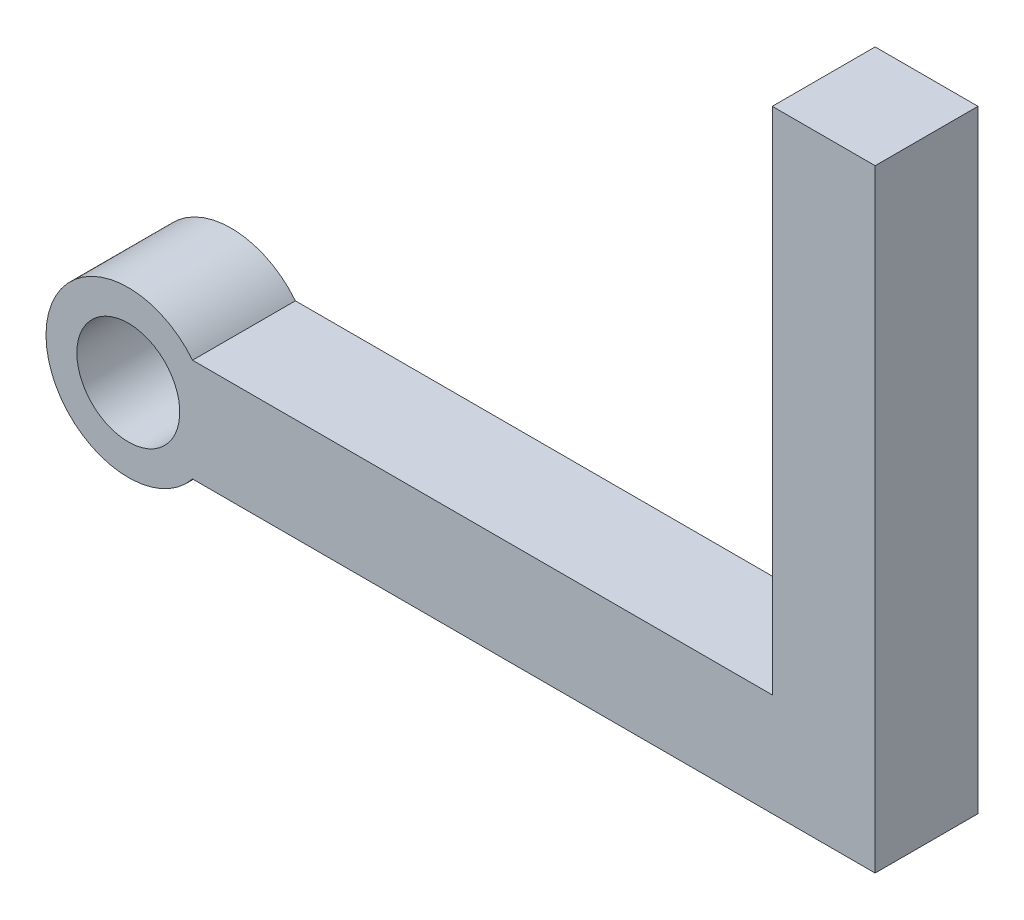
ISO-10303-21;
HEADER;
FILE_DESCRIPTION(('STEP AP214'),'2;1');
FILE_NAME('part.step','',(''),(''),'','','');
FILE_SCHEMA(('AUTOMOTIVE_DESIGN { 1 0 10303 214 1 1 1 1 }'));
ENDSEC;
DATA;
#1=APPLICATION_CONTEXT('core data for automotive mechanical design processes');
#2=APPLICATION_PROTOCOL_DEFINITION('international standard','automotive_design',2000,#1);
#3=PRODUCT_CONTEXT('',#1,'mechanical');
#4=PRODUCT('Part','Part','',(#3));
#5=PRODUCT_RELATED_PRODUCT_CATEGORY('part','',(#4));
#6=PRODUCT_DEFINITION_FORMATION('','',#4);
#7=PRODUCT_DEFINITION_CONTEXT('part definition',#1,'design');
#8=PRODUCT_DEFINITION('design','',#6,#7);
#9=PRODUCT_DEFINITION_SHAPE('','',#8);
#10=(LENGTH_UNIT() NAMED_UNIT(*) SI_UNIT(.MILLI.,.METRE.));
#11=(NAMED_UNIT(*) PLANE_ANGLE_UNIT() SI_UNIT($,.RADIAN.));
#12=(NAMED_UNIT(*) SI_UNIT($,.STERADIAN.) SOLID_ANGLE_UNIT());
#13=UNCERTAINTY_MEASURE_WITH_UNIT(LENGTH_MEASURE(1.E-05),#10,'distance_accuracy_value','');
#14=(GEOMETRIC_REPRESENTATION_CONTEXT(3) GLOBAL_UNCERTAINTY_ASSIGNED_CONTEXT((#13)) GLOBAL_UNIT_ASSIGNED_CONTEXT((#10,
#11,#12)) REPRESENTATION_CONTEXT('',''));
#15=CARTESIAN_POINT('',(0.,0.,0.));
#16=DIRECTION('',(0.,0.,1.));
#17=DIRECTION('',(1.,0.,0.));
#18=AXIS2_PLACEMENT_3D('',#15,#16,#17);
#19=CARTESIAN_POINT('',(0.,12.7,-31.75));
#20=DIRECTION('',(0.,0.,-1.));
#21=DIRECTION('',(-1.,0.,0.));
#22=AXIS2_PLACEMENT_3D('',#19,#20,#21);
#23=PLANE('',#22);
#24=CARTESIAN_POINT('',(-49.276,6.35,-31.75));
#25=DIRECTION('',(0.,0.,-1.));
#26=DIRECTION('',(-1.,0.,0.));
#27=AXIS2_PLACEMENT_3D('',#24,#25,#26);
#28=CIRCLE('',#27,6.34999999999999);
#29=CARTESIAN_POINT('',(-55.626,6.35,-31.75));
#30=VERTEX_POINT('',#29);
#31=EDGE_CURVE('E114',#30,#30,#28,.T.);
#32=ORIENTED_EDGE('',*,*,#31,.T.);
#33=EDGE_LOOP('',(#32));
#34=FACE_BOUND('',#33,.T.);
#35=DIRECTION('',(1.,0.,0.));
#36=VECTOR('',#35,1.);
#37=CARTESIAN_POINT('',(0.,12.7,-31.75));
#38=LINE('',#37,#36);
#39=CARTESIAN_POINT('',(-41.344852542034,12.7,-31.75));
#40=VERTEX_POINT('',#39);
#41=CARTESIAN_POINT('',(30.226,12.7,-31.75));
#42=VERTEX_POINT('',#41);
#43=EDGE_CURVE('E102',#40,#42,#38,.T.);
#44=ORIENTED_EDGE('',*,*,#43,.F.);
#45=CARTESIAN_POINT('',(-49.276,6.35,-31.75));
#46=DIRECTION('',(0.,0.,-1.));
#47=DIRECTION('',(-1.,0.,0.));
#48=AXIS2_PLACEMENT_3D('',#45,#46,#47);
#49=CIRCLE('',#48,10.16);
#50=CARTESIAN_POINT('',(-41.344852542034,0.,-31.75));
#51=VERTEX_POINT('',#50);
#52=EDGE_CURVE('E113',#51,#40,#49,.T.);
#53=ORIENTED_EDGE('',*,*,#52,.F.);
#54=DIRECTION('',(1.,0.,0.));
#55=VECTOR('',#54,1.);
#56=CARTESIAN_POINT('',(0.,0.,-31.75));
#57=LINE('',#56,#55);
#58=CARTESIAN_POINT('',(42.926,0.,-31.75));
#59=VERTEX_POINT('',#58);
#60=EDGE_CURVE('E107',#51,#59,#57,.T.);
#61=ORIENTED_EDGE('',*,*,#60,.T.);
#62=DIRECTION('',(0.,-1.,0.));
#63=VECTOR('',#62,1.);
#64=CARTESIAN_POINT('',(42.926,12.7,-31.75));
#65=LINE('',#64,#63);
#66=CARTESIAN_POINT('',(42.926,75.633072,-31.75));
#67=VERTEX_POINT('',#66);
#68=EDGE_CURVE('E49',#67,#59,#65,.T.);
#69=ORIENTED_EDGE('',*,*,#68,.F.);
#70=DIRECTION('',(1.,0.,0.));
#71=VECTOR('',#70,1.);
#72=CARTESIAN_POINT('',(30.226,75.633072,-31.75));
#73=LINE('',#72,#71);
#74=CARTESIAN_POINT('',(30.226,75.633072,-31.75));
#75=VERTEX_POINT('',#74);
#76=EDGE_CURVE('E136',#75,#67,#73,.T.);
#77=ORIENTED_EDGE('',*,*,#76,.F.);
#78=DIRECTION('',(0.,-1.,0.));
#79=VECTOR('',#78,1.);
#80=CARTESIAN_POINT('',(30.226,75.633072,-31.75));
#81=LINE('',#80,#79);
#82=EDGE_CURVE('E140',#75,#42,#81,.T.);
#83=ORIENTED_EDGE('',*,*,#82,.T.);
#84=EDGE_LOOP('',(#44,#53,#61,#69,#77,#83));
#85=FACE_BOUND('',#84,.T.);
#86=ADVANCED_FACE('F41',(#34,#85),#23,.F.);
#87=CARTESIAN_POINT('',(42.926,12.7,0.));
#88=DIRECTION('',(-1.,0.,0.));
#89=DIRECTION('',(0.,0.,1.));
#90=AXIS2_PLACEMENT_3D('',#87,#88,#89);
#91=PLANE('',#90);
#92=DIRECTION('',(0.,0.,-1.));
#93=VECTOR('',#92,1.);
#94=CARTESIAN_POINT('',(42.926,0.,0.));
#95=LINE('',#94,#93);
#96=CARTESIAN_POINT('',(42.926,0.,-44.45));
#97=VERTEX_POINT('',#96);
#98=EDGE_CURVE('E103',#59,#97,#95,.T.);
#99=ORIENTED_EDGE('',*,*,#98,.T.);
#100=DIRECTION('',(0.,-1.,0.));
#101=VECTOR('',#100,1.);
#102=CARTESIAN_POINT('',(42.926,12.7,-44.45));
#103=LINE('',#102,#101);
#104=CARTESIAN_POINT('',(42.926,75.633072,-44.45));
#105=VERTEX_POINT('',#104);
#106=EDGE_CURVE('E97',#105,#97,#103,.T.);
#107=ORIENTED_EDGE('',*,*,#106,.F.);
#108=DIRECTION('',(0.,0.,-1.));
#109=VECTOR('',#108,1.);
#110=CARTESIAN_POINT('',(42.926,75.633072,-31.75));
#111=LINE('',#110,#109);
#112=EDGE_CURVE('E126',#67,#105,#111,.T.);
#113=ORIENTED_EDGE('',*,*,#112,.F.);
#114=ORIENTED_EDGE('',*,*,#68,.T.);
#115=EDGE_LOOP('',(#99,#107,#113,#114));
#116=FACE_BOUND('',#115,.T.);
#117=ADVANCED_FACE('F164',(#116),#91,.F.);
#118=CARTESIAN_POINT('',(0.,12.7,-44.45));
#119=DIRECTION('',(0.,0.,-1.));
#120=DIRECTION('',(-1.,0.,0.));
#121=AXIS2_PLACEMENT_3D('',#118,#119,#120);
#122=PLANE('',#121);
#123=CARTESIAN_POINT('',(-49.276,6.35,-44.45));
#124=DIRECTION('',(0.,0.,-1.));
#125=DIRECTION('',(-1.,0.,0.));
#126=AXIS2_PLACEMENT_3D('',#123,#124,#125);
#127=CIRCLE('',#126,6.34999999999999);
#128=CARTESIAN_POINT('',(-55.626,6.35,-44.45));
#129=VERTEX_POINT('',#128);
#130=EDGE_CURVE('E120',#129,#129,#127,.T.);
#131=ORIENTED_EDGE('',*,*,#130,.F.);
#132=EDGE_LOOP('',(#131));
#133=FACE_BOUND('',#132,.T.);
#134=DIRECTION('',(1.,0.,0.));
#135=VECTOR('',#134,1.);
#136=CARTESIAN_POINT('',(0.,0.,-44.45));
#137=LINE('',#136,#135);
#138=CARTESIAN_POINT('',(-41.344852542034,0.,-44.45));
#139=VERTEX_POINT('',#138);
#140=EDGE_CURVE('E92',#139,#97,#137,.T.);
#141=ORIENTED_EDGE('',*,*,#140,.F.);
#142=CARTESIAN_POINT('',(-49.276,6.35,-44.45));
#143=DIRECTION('',(0.,0.,-1.));
#144=DIRECTION('',(-1.,0.,0.));
#145=AXIS2_PLACEMENT_3D('',#142,#143,#144);
#146=CIRCLE('',#145,10.16);
#147=CARTESIAN_POINT('',(-41.344852542034,12.7,-44.45));
#148=VERTEX_POINT('',#147);
#149=EDGE_CURVE('E95',#139,#148,#146,.T.);
#150=ORIENTED_EDGE('',*,*,#149,.T.);
#151=DIRECTION('',(1.,0.,0.));
#152=VECTOR('',#151,1.);
#153=CARTESIAN_POINT('',(0.,12.7,-44.45));
#154=LINE('',#153,#152);
#155=CARTESIAN_POINT('',(30.226,12.7,-44.45));
#156=VERTEX_POINT('',#155);
#157=EDGE_CURVE('E61',#148,#156,#154,.T.);
#158=ORIENTED_EDGE('',*,*,#157,.T.);
#159=DIRECTION('',(0.,-1.,0.));
#160=VECTOR('',#159,1.);
#161=CARTESIAN_POINT('',(30.226,75.633072,-44.45));
#162=LINE('',#161,#160);
#163=CARTESIAN_POINT('',(30.226,75.633072,-44.45));
#164=VERTEX_POINT('',#163);
#165=EDGE_CURVE('E147',#164,#156,#162,.T.);
#166=ORIENTED_EDGE('',*,*,#165,.F.);
#167=DIRECTION('',(-1.,0.,0.));
#168=VECTOR('',#167,1.);
#169=CARTESIAN_POINT('',(30.226,75.633072,-44.45));
#170=LINE('',#169,#168);
#171=EDGE_CURVE('E130',#105,#164,#170,.T.);
#172=ORIENTED_EDGE('',*,*,#171,.F.);
#173=ORIENTED_EDGE('',*,*,#106,.T.);
#174=EDGE_LOOP('',(#141,#150,#158,#166,#172,#173));
#175=FACE_BOUND('',#174,.T.);
#176=ADVANCED_FACE('F93',(#133,#175),#122,.T.);
#177=CARTESIAN_POINT('',(0.,12.7,0.));
#178=DIRECTION('',(0.,1.,0.));
#179=DIRECTION('',(0.,0.,1.));
#180=AXIS2_PLACEMENT_3D('',#177,#178,#179);
#181=PLANE('',#180);
#182=DIRECTION('',(0.,0.,-1.));
#183=VECTOR('',#182,1.);
#184=CARTESIAN_POINT('',(-41.344852542034,12.7,-31.75));
#185=LINE('',#184,#183);
#186=EDGE_CURVE('E56',#40,#148,#185,.T.);
#187=ORIENTED_EDGE('',*,*,#186,.F.);
#188=ORIENTED_EDGE('',*,*,#43,.T.);
#189=DIRECTION('',(0.,0.,1.));
#190=VECTOR('',#189,1.);
#191=CARTESIAN_POINT('',(30.226,12.7,-31.75));
#192=LINE('',#191,#190);
#193=EDGE_CURVE('E125',#156,#42,#192,.T.);
#194=ORIENTED_EDGE('',*,*,#193,.F.);
#195=ORIENTED_EDGE('',*,*,#157,.F.);
#196=EDGE_LOOP('',(#187,#188,#194,#195));
#197=FACE_BOUND('',#196,.T.);
#198=ADVANCED_FACE('F174',(#197),#181,.T.);
#199=CARTESIAN_POINT('',(0.,0.,0.));
#200=DIRECTION('',(0.,1.,0.));
#201=DIRECTION('',(0.,0.,1.));
#202=AXIS2_PLACEMENT_3D('',#199,#200,#201);
#203=PLANE('',#202);
#204=ORIENTED_EDGE('',*,*,#60,.F.);
#205=DIRECTION('',(0.,0.,-1.));
#206=VECTOR('',#205,1.);
#207=CARTESIAN_POINT('',(-41.344852542034,0.,-31.75));
#208=LINE('',#207,#206);
#209=EDGE_CURVE('E11',#51,#139,#208,.T.);
#210=ORIENTED_EDGE('',*,*,#209,.T.);
#211=ORIENTED_EDGE('',*,*,#140,.T.);
#212=ORIENTED_EDGE('',*,*,#98,.F.);
#213=EDGE_LOOP('',(#204,#210,#211,#212));
#214=FACE_BOUND('',#213,.T.);
#215=ADVANCED_FACE('F106',(#214),#203,.F.);
#216=CARTESIAN_POINT('',(30.226,75.633072,-31.75));
#217=DIRECTION('',(1.,0.,0.));
#218=DIRECTION('',(0.,0.,-1.));
#219=AXIS2_PLACEMENT_3D('',#216,#217,#218);
#220=PLANE('',#219);
#221=ORIENTED_EDGE('',*,*,#193,.T.);
#222=ORIENTED_EDGE('',*,*,#82,.F.);
#223=DIRECTION('',(0.,0.,1.));
#224=VECTOR('',#223,1.);
#225=CARTESIAN_POINT('',(30.226,75.633072,-31.75));
#226=LINE('',#225,#224);
#227=EDGE_CURVE('E133',#164,#75,#226,.T.);
#228=ORIENTED_EDGE('',*,*,#227,.F.);
#229=ORIENTED_EDGE('',*,*,#165,.T.);
#230=EDGE_LOOP('',(#221,#222,#228,#229));
#231=FACE_BOUND('',#230,.T.);
#232=ADVANCED_FACE('F173',(#231),#220,.F.);
#233=CARTESIAN_POINT('',(0.,75.633072,0.));
#234=DIRECTION('',(0.,-1.,0.));
#235=DIRECTION('',(0.,0.,-1.));
#236=AXIS2_PLACEMENT_3D('',#233,#234,#235);
#237=PLANE('',#236);
#238=ORIENTED_EDGE('',*,*,#112,.T.);
#239=ORIENTED_EDGE('',*,*,#171,.T.);
#240=ORIENTED_EDGE('',*,*,#227,.T.);
#241=ORIENTED_EDGE('',*,*,#76,.T.);
#242=EDGE_LOOP('',(#238,#239,#240,#241));
#243=FACE_BOUND('',#242,.T.);
#244=ADVANCED_FACE('F168',(#243),#237,.F.);
#245=CARTESIAN_POINT('',(-49.276,6.35,-31.75));
#246=DIRECTION('',(0.,0.,-1.));
#247=DIRECTION('',(-1.,0.,0.));
#248=AXIS2_PLACEMENT_3D('',#245,#246,#247);
#249=CYLINDRICAL_SURFACE('',#248,10.16);
#250=ORIENTED_EDGE('',*,*,#52,.T.);
#251=ORIENTED_EDGE('',*,*,#186,.T.);
#252=ORIENTED_EDGE('',*,*,#149,.F.);
#253=ORIENTED_EDGE('',*,*,#209,.F.);
#254=EDGE_LOOP('',(#250,#251,#252,#253));
#255=FACE_BOUND('',#254,.T.);
#256=ADVANCED_FACE('F111',(#255),#249,.T.);
#257=CARTESIAN_POINT('',(-49.276,6.35,-44.45));
#258=DIRECTION('',(0.,0.,-1.));
#259=DIRECTION('',(-1.,0.,0.));
#260=AXIS2_PLACEMENT_3D('',#257,#258,#259);
#261=CYLINDRICAL_SURFACE('',#260,6.34999999999999);
#262=ORIENTED_EDGE('',*,*,#31,.F.);
#263=EDGE_LOOP('',(#262));
#264=FACE_BOUND('',#263,.T.);
#265=ORIENTED_EDGE('',*,*,#130,.T.);
#266=EDGE_LOOP('',(#265));
#267=FACE_BOUND('',#266,.T.);
#268=ADVANCED_FACE('F192',(#264,#267),#261,.F.);
#269=CLOSED_SHELL('',(#86,#117,#176,#198,#215,#232,#244,#256,#268));
#270=MANIFOLD_SOLID_BREP('B2',#269);
#271=ADVANCED_BREP_SHAPE_REPRESENTATION('',(#18,#270),#14);
#272=SHAPE_DEFINITION_REPRESENTATION(#9,#271);
ENDSEC;
END-ISO-10303-21;
